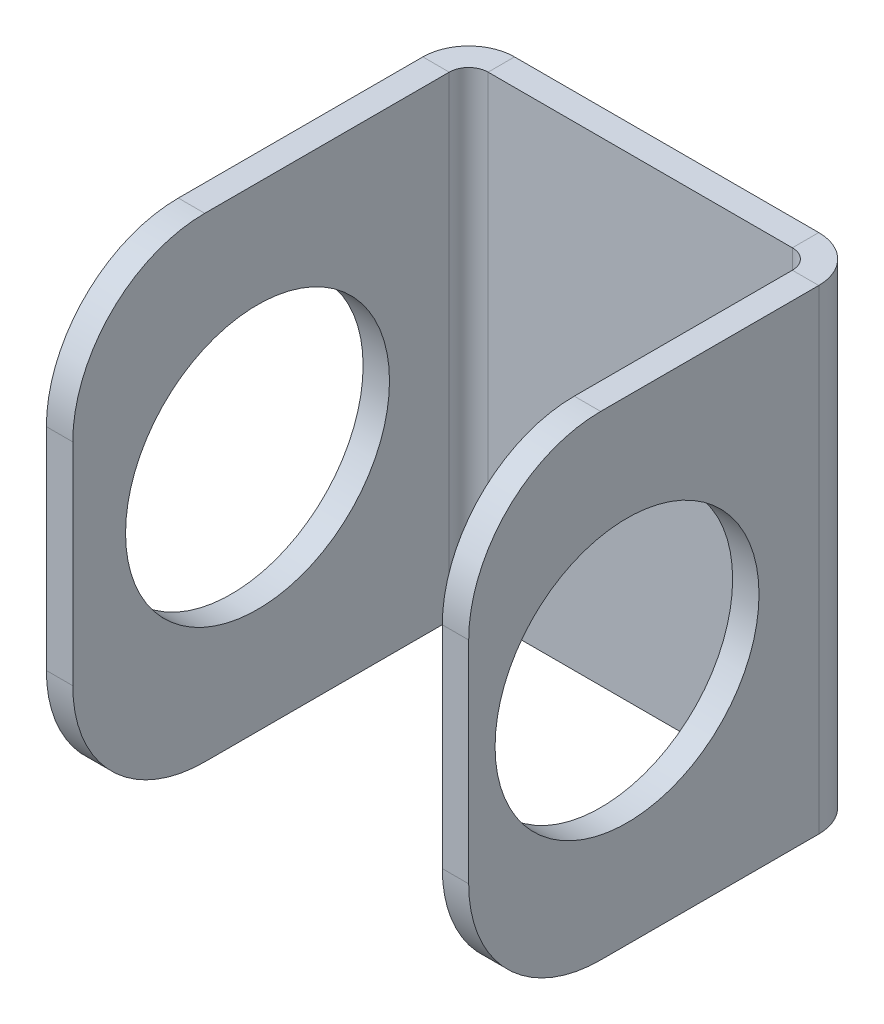
ISO-10303-21;
HEADER;
FILE_DESCRIPTION(('STEP AP214'),'2;1');
FILE_NAME('part.step','',(''),(''),'','','');
FILE_SCHEMA(('AUTOMOTIVE_DESIGN { 1 0 10303 214 1 1 1 1 }'));
ENDSEC;
DATA;
#1=APPLICATION_CONTEXT('core data for automotive mechanical design processes');
#2=APPLICATION_PROTOCOL_DEFINITION('international standard','automotive_design',2000,#1);
#3=PRODUCT_CONTEXT('',#1,'mechanical');
#4=PRODUCT('Part','Part','',(#3));
#5=PRODUCT_RELATED_PRODUCT_CATEGORY('part','',(#4));
#6=PRODUCT_DEFINITION_FORMATION('','',#4);
#7=PRODUCT_DEFINITION_CONTEXT('part definition',#1,'design');
#8=PRODUCT_DEFINITION('design','',#6,#7);
#9=PRODUCT_DEFINITION_SHAPE('','',#8);
#10=(LENGTH_UNIT() NAMED_UNIT(*) SI_UNIT(.MILLI.,.METRE.));
#11=(NAMED_UNIT(*) PLANE_ANGLE_UNIT() SI_UNIT($,.RADIAN.));
#12=(NAMED_UNIT(*) SI_UNIT($,.STERADIAN.) SOLID_ANGLE_UNIT());
#13=UNCERTAINTY_MEASURE_WITH_UNIT(LENGTH_MEASURE(1.E-05),#10,'distance_accuracy_value','');
#14=(GEOMETRIC_REPRESENTATION_CONTEXT(3) GLOBAL_UNCERTAINTY_ASSIGNED_CONTEXT((#13)) GLOBAL_UNIT_ASSIGNED_CONTEXT((#10,
#11,#12)) REPRESENTATION_CONTEXT('',''));
#15=CARTESIAN_POINT('',(0.,0.,0.));
#16=DIRECTION('',(0.,0.,1.));
#17=DIRECTION('',(1.,0.,0.));
#18=AXIS2_PLACEMENT_3D('',#15,#16,#17);
#19=CARTESIAN_POINT('',(0.,0.,-1.));
#20=DIRECTION('',(0.,0.,-1.));
#21=DIRECTION('',(-1.,0.,0.));
#22=AXIS2_PLACEMENT_3D('',#19,#20,#21);
#23=PLANE('',#22);
#24=DIRECTION('',(1.,0.,0.));
#25=VECTOR('',#24,1.);
#26=CARTESIAN_POINT('',(-7.5,-9.,-1.));
#27=LINE('',#26,#25);
#28=CARTESIAN_POINT('',(-5.7634,-9.,-0.999999999999999));
#29=VERTEX_POINT('',#28);
#30=CARTESIAN_POINT('',(5.7634,-9.,-1.));
#31=VERTEX_POINT('',#30);
#32=EDGE_CURVE('E309',#29,#31,#27,.T.);
#33=ORIENTED_EDGE('',*,*,#32,.F.);
#34=DIRECTION('',(0.,-1.,0.));
#35=VECTOR('',#34,1.);
#36=CARTESIAN_POINT('',(-5.7634,-9.,-0.999999999999999));
#37=LINE('',#36,#35);
#38=CARTESIAN_POINT('',(-5.7634,9.00000000000001,-1.));
#39=VERTEX_POINT('',#38);
#40=EDGE_CURVE('E203',#29,#39,#37,.F.);
#41=ORIENTED_EDGE('',*,*,#40,.T.);
#42=DIRECTION('',(-1.,0.,0.));
#43=VECTOR('',#42,1.);
#44=CARTESIAN_POINT('',(-7.5,9.,-1.));
#45=LINE('',#44,#43);
#46=CARTESIAN_POINT('',(5.7634,9.,-1.));
#47=VERTEX_POINT('',#46);
#48=EDGE_CURVE('E306',#47,#39,#45,.T.);
#49=ORIENTED_EDGE('',*,*,#48,.F.);
#50=DIRECTION('',(0.,1.,0.));
#51=VECTOR('',#50,1.);
#52=CARTESIAN_POINT('',(5.7634,9.,-1.));
#53=LINE('',#52,#51);
#54=EDGE_CURVE('E282',#47,#31,#53,.F.);
#55=ORIENTED_EDGE('',*,*,#54,.T.);
#56=EDGE_LOOP('',(#33,#41,#49,#55));
#57=FACE_BOUND('',#56,.T.);
#58=ADVANCED_FACE('F80',(#57),#23,.T.);
#59=CARTESIAN_POINT('',(0.,0.,0.));
#60=DIRECTION('',(0.,0.,-1.));
#61=DIRECTION('',(-1.,0.,0.));
#62=AXIS2_PLACEMENT_3D('',#59,#60,#61);
#63=PLANE('',#62);
#64=DIRECTION('',(0.,-1.,0.));
#65=VECTOR('',#64,1.);
#66=CARTESIAN_POINT('',(-5.7634,-9.,0.));
#67=LINE('',#66,#65);
#68=CARTESIAN_POINT('',(-5.7634,-9.,0.));
#69=VERTEX_POINT('',#68);
#70=CARTESIAN_POINT('',(-5.7634,9.,0.));
#71=VERTEX_POINT('',#70);
#72=EDGE_CURVE('E247',#69,#71,#67,.F.);
#73=ORIENTED_EDGE('',*,*,#72,.F.);
#74=DIRECTION('',(1.,0.,0.));
#75=VECTOR('',#74,1.);
#76=CARTESIAN_POINT('',(-7.5,-9.,0.));
#77=LINE('',#76,#75);
#78=CARTESIAN_POINT('',(5.7634,-9.,0.));
#79=VERTEX_POINT('',#78);
#80=EDGE_CURVE('E310',#69,#79,#77,.T.);
#81=ORIENTED_EDGE('',*,*,#80,.T.);
#82=DIRECTION('',(0.,1.,0.));
#83=VECTOR('',#82,1.);
#84=CARTESIAN_POINT('',(5.7634,9.,0.));
#85=LINE('',#84,#83);
#86=CARTESIAN_POINT('',(5.7634,9.,0.));
#87=VERTEX_POINT('',#86);
#88=EDGE_CURVE('E295',#87,#79,#85,.F.);
#89=ORIENTED_EDGE('',*,*,#88,.F.);
#90=DIRECTION('',(-1.,0.,0.));
#91=VECTOR('',#90,1.);
#92=CARTESIAN_POINT('',(-7.5,9.,0.));
#93=LINE('',#92,#91);
#94=EDGE_CURVE('E303',#87,#71,#93,.T.);
#95=ORIENTED_EDGE('',*,*,#94,.T.);
#96=EDGE_LOOP('',(#73,#81,#89,#95));
#97=FACE_BOUND('',#96,.T.);
#98=ADVANCED_FACE('F377',(#97),#63,.F.);
#99=CARTESIAN_POINT('',(-7.5,-9.,-1.));
#100=DIRECTION('',(0.,-1.,0.));
#101=DIRECTION('',(0.,0.,-1.));
#102=AXIS2_PLACEMENT_3D('',#99,#100,#101);
#103=PLANE('',#102);
#104=ORIENTED_EDGE('',*,*,#80,.F.);
#105=DIRECTION('',(0.,0.,-1.));
#106=VECTOR('',#105,1.);
#107=CARTESIAN_POINT('',(-5.7634,-9.,0.));
#108=LINE('',#107,#106);
#109=EDGE_CURVE('E243',#69,#29,#108,.T.);
#110=ORIENTED_EDGE('',*,*,#109,.T.);
#111=ORIENTED_EDGE('',*,*,#32,.T.);
#112=DIRECTION('',(0.,0.,-1.));
#113=VECTOR('',#112,1.);
#114=CARTESIAN_POINT('',(5.7634,-9.,0.));
#115=LINE('',#114,#113);
#116=EDGE_CURVE('E300',#79,#31,#115,.T.);
#117=ORIENTED_EDGE('',*,*,#116,.F.);
#118=EDGE_LOOP('',(#104,#110,#111,#117));
#119=FACE_BOUND('',#118,.T.);
#120=ADVANCED_FACE('F389',(#119),#103,.T.);
#121=CARTESIAN_POINT('',(-7.5,9.,-1.));
#122=DIRECTION('',(0.,1.,0.));
#123=DIRECTION('',(0.,0.,1.));
#124=AXIS2_PLACEMENT_3D('',#121,#122,#123);
#125=PLANE('',#124);
#126=DIRECTION('',(0.,0.,-1.));
#127=VECTOR('',#126,1.);
#128=CARTESIAN_POINT('',(-5.7634,9.,0.));
#129=LINE('',#128,#127);
#130=EDGE_CURVE('E250',#71,#39,#129,.T.);
#131=ORIENTED_EDGE('',*,*,#130,.F.);
#132=ORIENTED_EDGE('',*,*,#94,.F.);
#133=DIRECTION('',(0.,0.,-1.));
#134=VECTOR('',#133,1.);
#135=CARTESIAN_POINT('',(5.7634,9.,0.));
#136=LINE('',#135,#134);
#137=EDGE_CURVE('E289',#87,#47,#136,.T.);
#138=ORIENTED_EDGE('',*,*,#137,.T.);
#139=ORIENTED_EDGE('',*,*,#48,.T.);
#140=EDGE_LOOP('',(#131,#132,#138,#139));
#141=FACE_BOUND('',#140,.T.);
#142=ADVANCED_FACE('F373',(#141),#125,.T.);
#143=CARTESIAN_POINT('',(5.7634,-9.,0.7366));
#144=DIRECTION('',(0.,-1.,0.));
#145=DIRECTION('',(0.,0.,-1.));
#146=AXIS2_PLACEMENT_3D('',#143,#144,#145);
#147=PLANE('',#146);
#148=DIRECTION('',(-1.,0.,0.));
#149=VECTOR('',#148,1.);
#150=CARTESIAN_POINT('',(7.5,-9.,0.736599999999994));
#151=LINE('',#150,#149);
#152=CARTESIAN_POINT('',(6.5,-9.,0.736599999999997));
#153=VERTEX_POINT('',#152);
#154=CARTESIAN_POINT('',(7.5,-9.,0.736599999999994));
#155=VERTEX_POINT('',#154);
#156=EDGE_CURVE('E253',#153,#155,#151,.F.);
#157=ORIENTED_EDGE('',*,*,#156,.F.);
#158=CARTESIAN_POINT('',(5.7634,-9.,0.7366));
#159=DIRECTION('',(0.,1.,0.));
#160=DIRECTION('',(0.,0.,1.));
#161=AXIS2_PLACEMENT_3D('',#158,#159,#160);
#162=CIRCLE('',#161,0.7366);
#163=EDGE_CURVE('E292',#79,#153,#162,.F.);
#164=ORIENTED_EDGE('',*,*,#163,.F.);
#165=ORIENTED_EDGE('',*,*,#116,.T.);
#166=CARTESIAN_POINT('',(5.7634,-9.,0.7366));
#167=DIRECTION('',(0.,1.,0.));
#168=DIRECTION('',(0.,0.,1.));
#169=AXIS2_PLACEMENT_3D('',#166,#167,#168);
#170=CIRCLE('',#169,1.7366);
#171=EDGE_CURVE('E285',#31,#155,#170,.F.);
#172=ORIENTED_EDGE('',*,*,#171,.T.);
#173=EDGE_LOOP('',(#157,#164,#165,#172));
#174=FACE_BOUND('',#173,.T.);
#175=ADVANCED_FACE('F387',(#174),#147,.T.);
#176=CARTESIAN_POINT('',(5.7634,9.,0.736599999999999));
#177=DIRECTION('',(0.,-1.,0.));
#178=DIRECTION('',(0.,0.,-1.));
#179=AXIS2_PLACEMENT_3D('',#176,#177,#178);
#180=PLANE('',#179);
#181=CARTESIAN_POINT('',(5.7634,9.,0.736599999999999));
#182=DIRECTION('',(0.,1.,0.));
#183=DIRECTION('',(0.,0.,1.));
#184=AXIS2_PLACEMENT_3D('',#181,#182,#183);
#185=CIRCLE('',#184,0.7366);
#186=CARTESIAN_POINT('',(6.5,9.,0.736599999999996));
#187=VERTEX_POINT('',#186);
#188=EDGE_CURVE('E258',#187,#87,#185,.T.);
#189=ORIENTED_EDGE('',*,*,#188,.F.);
#190=DIRECTION('',(-1.,0.,0.));
#191=VECTOR('',#190,1.);
#192=CARTESIAN_POINT('',(6.5,8.99999999999999,0.736599999999996));
#193=LINE('',#192,#191);
#194=CARTESIAN_POINT('',(7.5,9.,0.736599999999993));
#195=VERTEX_POINT('',#194);
#196=EDGE_CURVE('E275',#187,#195,#193,.F.);
#197=ORIENTED_EDGE('',*,*,#196,.T.);
#198=CARTESIAN_POINT('',(5.7634,9.,0.736599999999999));
#199=DIRECTION('',(0.,1.,0.));
#200=DIRECTION('',(0.,0.,1.));
#201=AXIS2_PLACEMENT_3D('',#198,#199,#200);
#202=CIRCLE('',#201,1.7366);
#203=EDGE_CURVE('E286',#195,#47,#202,.T.);
#204=ORIENTED_EDGE('',*,*,#203,.T.);
#205=ORIENTED_EDGE('',*,*,#137,.F.);
#206=EDGE_LOOP('',(#189,#197,#204,#205));
#207=FACE_BOUND('',#206,.T.);
#208=ADVANCED_FACE('F407',(#207),#180,.F.);
#209=CARTESIAN_POINT('',(5.7634,9.,0.736599999999999));
#210=DIRECTION('',(0.,1.,0.));
#211=DIRECTION('',(1.,0.,0.));
#212=AXIS2_PLACEMENT_3D('',#209,#210,#211);
#213=CYLINDRICAL_SURFACE('',#212,1.7366);
#214=ORIENTED_EDGE('',*,*,#54,.F.);
#215=ORIENTED_EDGE('',*,*,#203,.F.);
#216=DIRECTION('',(0.,1.,0.));
#217=VECTOR('',#216,1.);
#218=CARTESIAN_POINT('',(7.5,-9.,0.736599999999994));
#219=LINE('',#218,#217);
#220=EDGE_CURVE('E272',#195,#155,#219,.F.);
#221=ORIENTED_EDGE('',*,*,#220,.T.);
#222=ORIENTED_EDGE('',*,*,#171,.F.);
#223=EDGE_LOOP('',(#214,#215,#221,#222));
#224=FACE_BOUND('',#223,.T.);
#225=ADVANCED_FACE('F394',(#224),#213,.T.);
#226=CARTESIAN_POINT('',(5.7634,9.,0.736599999999999));
#227=DIRECTION('',(0.,1.,0.));
#228=DIRECTION('',(1.,0.,0.));
#229=AXIS2_PLACEMENT_3D('',#226,#227,#228);
#230=CYLINDRICAL_SURFACE('',#229,0.7366);
#231=ORIENTED_EDGE('',*,*,#88,.T.);
#232=ORIENTED_EDGE('',*,*,#163,.T.);
#233=DIRECTION('',(0.,1.,0.));
#234=VECTOR('',#233,1.);
#235=CARTESIAN_POINT('',(6.5,-9.,0.736599999999998));
#236=LINE('',#235,#234);
#237=EDGE_CURVE('E278',#153,#187,#236,.T.);
#238=ORIENTED_EDGE('',*,*,#237,.T.);
#239=ORIENTED_EDGE('',*,*,#188,.T.);
#240=EDGE_LOOP('',(#231,#232,#238,#239));
#241=FACE_BOUND('',#240,.T.);
#242=ADVANCED_FACE('F381',(#241),#230,.F.);
#243=CARTESIAN_POINT('',(7.5,-9.,0.));
#244=DIRECTION('',(0.,1.,0.));
#245=DIRECTION('',(0.,0.,1.));
#246=AXIS2_PLACEMENT_3D('',#243,#244,#245);
#247=PLANE('',#246);
#248=DIRECTION('',(0.,0.,-1.));
#249=VECTOR('',#248,1.);
#250=CARTESIAN_POINT('',(7.5,-9.,0.));
#251=LINE('',#250,#249);
#252=CARTESIAN_POINT('',(7.50000000000003,-9.,9.));
#253=VERTEX_POINT('',#252);
#254=EDGE_CURVE('E262',#253,#155,#251,.T.);
#255=ORIENTED_EDGE('',*,*,#254,.F.);
#256=DIRECTION('',(-1.,0.,0.));
#257=VECTOR('',#256,1.);
#258=CARTESIAN_POINT('',(7.50000000000003,-9.,9.));
#259=LINE('',#258,#257);
#260=CARTESIAN_POINT('',(6.50000000000003,-9.,9.));
#261=VERTEX_POINT('',#260);
#262=EDGE_CURVE('E334',#253,#261,#259,.T.);
#263=ORIENTED_EDGE('',*,*,#262,.T.);
#264=DIRECTION('',(0.,0.,1.));
#265=VECTOR('',#264,1.);
#266=CARTESIAN_POINT('',(6.5,-9.,0.));
#267=LINE('',#266,#265);
#268=EDGE_CURVE('E270',#261,#153,#267,.F.);
#269=ORIENTED_EDGE('',*,*,#268,.T.);
#270=ORIENTED_EDGE('',*,*,#156,.T.);
#271=EDGE_LOOP('',(#255,#263,#269,#270));
#272=FACE_BOUND('',#271,.T.);
#273=ADVANCED_FACE('F398',(#272),#247,.F.);
#274=CARTESIAN_POINT('',(7.50000000000005,9.,14.));
#275=DIRECTION('',(0.,-1.,0.));
#276=DIRECTION('',(0.,0.,-1.));
#277=AXIS2_PLACEMENT_3D('',#274,#275,#276);
#278=PLANE('',#277);
#279=DIRECTION('',(0.,0.,-1.));
#280=VECTOR('',#279,1.);
#281=CARTESIAN_POINT('',(6.50000000000005,9.,14.));
#282=LINE('',#281,#280);
#283=CARTESIAN_POINT('',(6.50000000000003,9.,9.));
#284=VERTEX_POINT('',#283);
#285=EDGE_CURVE('E267',#187,#284,#282,.F.);
#286=ORIENTED_EDGE('',*,*,#285,.T.);
#287=DIRECTION('',(-1.,0.,0.));
#288=VECTOR('',#287,1.);
#289=CARTESIAN_POINT('',(7.50000000000003,9.,9.));
#290=LINE('',#289,#288);
#291=CARTESIAN_POINT('',(7.50000000000003,9.,9.));
#292=VERTEX_POINT('',#291);
#293=EDGE_CURVE('E328',#284,#292,#290,.F.);
#294=ORIENTED_EDGE('',*,*,#293,.T.);
#295=DIRECTION('',(0.,0.,1.));
#296=VECTOR('',#295,1.);
#297=CARTESIAN_POINT('',(7.5,9.,0.));
#298=LINE('',#297,#296);
#299=EDGE_CURVE('E259',#195,#292,#298,.T.);
#300=ORIENTED_EDGE('',*,*,#299,.F.);
#301=ORIENTED_EDGE('',*,*,#196,.F.);
#302=EDGE_LOOP('',(#286,#294,#300,#301));
#303=FACE_BOUND('',#302,.T.);
#304=ADVANCED_FACE('F410',(#303),#278,.F.);
#305=CARTESIAN_POINT('',(7.5,0.,0.));
#306=DIRECTION('',(-1.,0.,0.));
#307=DIRECTION('',(0.,0.,1.));
#308=AXIS2_PLACEMENT_3D('',#305,#306,#307);
#309=PLANE('',#308);
#310=CARTESIAN_POINT('',(7.50000000000007,0.,8.00000000000003));
#311=DIRECTION('',(-1.,0.,0.));
#312=DIRECTION('',(0.,0.,1.));
#313=AXIS2_PLACEMENT_3D('',#310,#311,#312);
#314=CIRCLE('',#313,5.);
#315=CARTESIAN_POINT('',(7.50000000000006,0.,13.));
#316=VERTEX_POINT('',#315);
#317=EDGE_CURVE('E319',#316,#316,#314,.T.);
#318=ORIENTED_EDGE('',*,*,#317,.T.);
#319=EDGE_LOOP('',(#318));
#320=FACE_BOUND('',#319,.T.);
#321=ORIENTED_EDGE('',*,*,#299,.T.);
#322=CARTESIAN_POINT('',(7.50000000000003,4.,9.));
#323=DIRECTION('',(-1.,0.,0.));
#324=DIRECTION('',(0.,0.,1.));
#325=AXIS2_PLACEMENT_3D('',#322,#323,#324);
#326=CIRCLE('',#325,5.);
#327=CARTESIAN_POINT('',(7.50000000000005,4.,14.));
#328=VERTEX_POINT('',#327);
#329=EDGE_CURVE('E332',#292,#328,#326,.F.);
#330=ORIENTED_EDGE('',*,*,#329,.T.);
#331=DIRECTION('',(0.,-1.,0.));
#332=VECTOR('',#331,1.);
#333=CARTESIAN_POINT('',(7.50000000000005,0.,14.));
#334=LINE('',#333,#332);
#335=CARTESIAN_POINT('',(7.50000000000005,-4.,14.));
#336=VERTEX_POINT('',#335);
#337=EDGE_CURVE('E255',#328,#336,#334,.T.);
#338=ORIENTED_EDGE('',*,*,#337,.T.);
#339=CARTESIAN_POINT('',(7.50000000000003,-4.,9.));
#340=DIRECTION('',(-1.,0.,0.));
#341=DIRECTION('',(0.,0.,1.));
#342=AXIS2_PLACEMENT_3D('',#339,#340,#341);
#343=CIRCLE('',#342,5.);
#344=EDGE_CURVE('E330',#336,#253,#343,.F.);
#345=ORIENTED_EDGE('',*,*,#344,.T.);
#346=ORIENTED_EDGE('',*,*,#254,.T.);
#347=ORIENTED_EDGE('',*,*,#220,.F.);
#348=EDGE_LOOP('',(#321,#330,#338,#345,#346,#347));
#349=FACE_BOUND('',#348,.T.);
#350=ADVANCED_FACE('F414',(#320,#349),#309,.F.);
#351=CARTESIAN_POINT('',(6.5,0.,0.));
#352=DIRECTION('',(-1.,0.,0.));
#353=DIRECTION('',(0.,0.,1.));
#354=AXIS2_PLACEMENT_3D('',#351,#352,#353);
#355=PLANE('',#354);
#356=CARTESIAN_POINT('',(6.50000000000003,0.,8.00000000000002));
#357=DIRECTION('',(-1.,0.,0.));
#358=DIRECTION('',(0.,0.,1.));
#359=AXIS2_PLACEMENT_3D('',#356,#357,#358);
#360=CIRCLE('',#359,5.);
#361=CARTESIAN_POINT('',(6.50000000000004,0.,13.));
#362=VERTEX_POINT('',#361);
#363=EDGE_CURVE('E240',#362,#362,#360,.T.);
#364=ORIENTED_EDGE('',*,*,#363,.F.);
#365=EDGE_LOOP('',(#364));
#366=FACE_BOUND('',#365,.T.);
#367=DIRECTION('',(0.,1.,0.));
#368=VECTOR('',#367,1.);
#369=CARTESIAN_POINT('',(6.50000000000005,-9.,14.));
#370=LINE('',#369,#368);
#371=CARTESIAN_POINT('',(6.50000000000005,4.,14.));
#372=VERTEX_POINT('',#371);
#373=CARTESIAN_POINT('',(6.50000000000005,-4.,14.));
#374=VERTEX_POINT('',#373);
#375=EDGE_CURVE('E264',#372,#374,#370,.F.);
#376=ORIENTED_EDGE('',*,*,#375,.F.);
#377=CARTESIAN_POINT('',(6.50000000000003,4.,9.));
#378=DIRECTION('',(-1.,0.,0.));
#379=DIRECTION('',(0.,0.,1.));
#380=AXIS2_PLACEMENT_3D('',#377,#378,#379);
#381=CIRCLE('',#380,5.);
#382=EDGE_CURVE('E326',#372,#284,#381,.T.);
#383=ORIENTED_EDGE('',*,*,#382,.T.);
#384=ORIENTED_EDGE('',*,*,#285,.F.);
#385=ORIENTED_EDGE('',*,*,#237,.F.);
#386=ORIENTED_EDGE('',*,*,#268,.F.);
#387=CARTESIAN_POINT('',(6.50000000000003,-4.,9.));
#388=DIRECTION('',(-1.,0.,0.));
#389=DIRECTION('',(0.,0.,1.));
#390=AXIS2_PLACEMENT_3D('',#387,#388,#389);
#391=CIRCLE('',#390,5.);
#392=EDGE_CURVE('E324',#261,#374,#391,.T.);
#393=ORIENTED_EDGE('',*,*,#392,.T.);
#394=EDGE_LOOP('',(#376,#383,#384,#385,#386,#393));
#395=FACE_BOUND('',#394,.T.);
#396=ADVANCED_FACE('F403',(#366,#395),#355,.T.);
#397=CARTESIAN_POINT('',(7.50000000000005,-9.,14.));
#398=DIRECTION('',(0.,0.,-1.));
#399=DIRECTION('',(-1.,0.,0.));
#400=AXIS2_PLACEMENT_3D('',#397,#398,#399);
#401=PLANE('',#400);
#402=ORIENTED_EDGE('',*,*,#337,.F.);
#403=DIRECTION('',(-1.,0.,0.));
#404=VECTOR('',#403,1.);
#405=CARTESIAN_POINT('',(7.50000000000005,4.,14.));
#406=LINE('',#405,#404);
#407=EDGE_CURVE('E321',#328,#372,#406,.T.);
#408=ORIENTED_EDGE('',*,*,#407,.T.);
#409=ORIENTED_EDGE('',*,*,#375,.T.);
#410=DIRECTION('',(-1.,0.,0.));
#411=VECTOR('',#410,1.);
#412=CARTESIAN_POINT('',(7.50000000000005,-4.,14.));
#413=LINE('',#412,#411);
#414=EDGE_CURVE('E312',#374,#336,#413,.F.);
#415=ORIENTED_EDGE('',*,*,#414,.T.);
#416=EDGE_LOOP('',(#402,#408,#409,#415));
#417=FACE_BOUND('',#416,.T.);
#418=ADVANCED_FACE('F420',(#417),#401,.F.);
#419=CARTESIAN_POINT('',(-5.7634,9.,0.7366));
#420=DIRECTION('',(0.,1.,0.));
#421=DIRECTION('',(0.,0.,1.));
#422=AXIS2_PLACEMENT_3D('',#419,#420,#421);
#423=PLANE('',#422);
#424=DIRECTION('',(1.,0.,0.));
#425=VECTOR('',#424,1.);
#426=CARTESIAN_POINT('',(-7.5,9.,0.736599999999994));
#427=LINE('',#426,#425);
#428=CARTESIAN_POINT('',(-6.5,9.,0.736599999999998));
#429=VERTEX_POINT('',#428);
#430=CARTESIAN_POINT('',(-7.5,9.,0.736599999999994));
#431=VERTEX_POINT('',#430);
#432=EDGE_CURVE('E237',#429,#431,#427,.F.);
#433=ORIENTED_EDGE('',*,*,#432,.F.);
#434=CARTESIAN_POINT('',(-5.7634,9.,0.7366));
#435=DIRECTION('',(0.,-1.,0.));
#436=DIRECTION('',(0.,0.,-1.));
#437=AXIS2_PLACEMENT_3D('',#434,#435,#436);
#438=CIRCLE('',#437,0.7366);
#439=EDGE_CURVE('E206',#71,#429,#438,.F.);
#440=ORIENTED_EDGE('',*,*,#439,.F.);
#441=ORIENTED_EDGE('',*,*,#130,.T.);
#442=CARTESIAN_POINT('',(-5.7634,9.,0.7366));
#443=DIRECTION('',(0.,-1.,0.));
#444=DIRECTION('',(0.,0.,-1.));
#445=AXIS2_PLACEMENT_3D('',#442,#443,#444);
#446=CIRCLE('',#445,1.7366);
#447=EDGE_CURVE('E242',#39,#431,#446,.F.);
#448=ORIENTED_EDGE('',*,*,#447,.T.);
#449=EDGE_LOOP('',(#433,#440,#441,#448));
#450=FACE_BOUND('',#449,.T.);
#451=ADVANCED_FACE('F370',(#450),#423,.T.);
#452=CARTESIAN_POINT('',(-5.7634,-9.,0.7366));
#453=DIRECTION('',(0.,1.,0.));
#454=DIRECTION('',(0.,0.,1.));
#455=AXIS2_PLACEMENT_3D('',#452,#453,#454);
#456=PLANE('',#455);
#457=CARTESIAN_POINT('',(-5.7634,-9.,0.7366));
#458=DIRECTION('',(0.,-1.,0.));
#459=DIRECTION('',(0.,0.,-1.));
#460=AXIS2_PLACEMENT_3D('',#457,#458,#459);
#461=CIRCLE('',#460,0.7366);
#462=CARTESIAN_POINT('',(-6.5,-9.,0.736599999999998));
#463=VERTEX_POINT('',#462);
#464=EDGE_CURVE('E213',#463,#69,#461,.T.);
#465=ORIENTED_EDGE('',*,*,#464,.F.);
#466=DIRECTION('',(1.,0.,0.));
#467=VECTOR('',#466,1.);
#468=CARTESIAN_POINT('',(-6.5,-9.,0.736599999999998));
#469=LINE('',#468,#467);
#470=CARTESIAN_POINT('',(-7.5,-9.,0.736599999999994));
#471=VERTEX_POINT('',#470);
#472=EDGE_CURVE('E210',#463,#471,#469,.F.);
#473=ORIENTED_EDGE('',*,*,#472,.T.);
#474=CARTESIAN_POINT('',(-5.7634,-9.,0.7366));
#475=DIRECTION('',(0.,-1.,0.));
#476=DIRECTION('',(0.,0.,-1.));
#477=AXIS2_PLACEMENT_3D('',#474,#475,#476);
#478=CIRCLE('',#477,1.7366);
#479=EDGE_CURVE('E196',#471,#29,#478,.T.);
#480=ORIENTED_EDGE('',*,*,#479,.T.);
#481=ORIENTED_EDGE('',*,*,#109,.F.);
#482=EDGE_LOOP('',(#465,#473,#480,#481));
#483=FACE_BOUND('',#482,.T.);
#484=ADVANCED_FACE('F211',(#483),#456,.F.);
#485=CARTESIAN_POINT('',(-5.7634,-9.,0.7366));
#486=DIRECTION('',(0.,-1.,0.));
#487=DIRECTION('',(-1.,0.,0.));
#488=AXIS2_PLACEMENT_3D('',#485,#486,#487);
#489=CYLINDRICAL_SURFACE('',#488,1.7366);
#490=ORIENTED_EDGE('',*,*,#40,.F.);
#491=ORIENTED_EDGE('',*,*,#479,.F.);
#492=DIRECTION('',(0.,-1.,0.));
#493=VECTOR('',#492,1.);
#494=CARTESIAN_POINT('',(-7.5,9.,0.736599999999994));
#495=LINE('',#494,#493);
#496=EDGE_CURVE('E200',#471,#431,#495,.F.);
#497=ORIENTED_EDGE('',*,*,#496,.T.);
#498=ORIENTED_EDGE('',*,*,#447,.F.);
#499=EDGE_LOOP('',(#490,#491,#497,#498));
#500=FACE_BOUND('',#499,.T.);
#501=ADVANCED_FACE('F198',(#500),#489,.T.);
#502=CARTESIAN_POINT('',(-5.7634,-9.,0.7366));
#503=DIRECTION('',(0.,-1.,0.));
#504=DIRECTION('',(-1.,0.,0.));
#505=AXIS2_PLACEMENT_3D('',#502,#503,#504);
#506=CYLINDRICAL_SURFACE('',#505,0.7366);
#507=ORIENTED_EDGE('',*,*,#72,.T.);
#508=ORIENTED_EDGE('',*,*,#439,.T.);
#509=DIRECTION('',(0.,-1.,0.));
#510=VECTOR('',#509,1.);
#511=CARTESIAN_POINT('',(-6.5,9.,0.736599999999998));
#512=LINE('',#511,#510);
#513=EDGE_CURVE('E215',#429,#463,#512,.T.);
#514=ORIENTED_EDGE('',*,*,#513,.T.);
#515=ORIENTED_EDGE('',*,*,#464,.T.);
#516=EDGE_LOOP('',(#507,#508,#514,#515));
#517=FACE_BOUND('',#516,.T.);
#518=ADVANCED_FACE('F365',(#517),#506,.F.);
#519=CARTESIAN_POINT('',(-7.5,9.,0.));
#520=DIRECTION('',(0.,-1.,0.));
#521=DIRECTION('',(0.,0.,-1.));
#522=AXIS2_PLACEMENT_3D('',#519,#520,#521);
#523=PLANE('',#522);
#524=DIRECTION('',(0.,0.,-1.));
#525=VECTOR('',#524,1.);
#526=CARTESIAN_POINT('',(-7.5,9.,0.));
#527=LINE('',#526,#525);
#528=CARTESIAN_POINT('',(-7.50000000000004,9.,9.99999999999999));
#529=VERTEX_POINT('',#528);
#530=EDGE_CURVE('E220',#529,#431,#527,.T.);
#531=ORIENTED_EDGE('',*,*,#530,.F.);
#532=DIRECTION('',(1.,0.,0.));
#533=VECTOR('',#532,1.);
#534=CARTESIAN_POINT('',(-7.50000000000004,9.,9.99999999999999));
#535=LINE('',#534,#533);
#536=CARTESIAN_POINT('',(-6.50000000000004,9.,10.));
#537=VERTEX_POINT('',#536);
#538=EDGE_CURVE('E13',#529,#537,#535,.T.);
#539=ORIENTED_EDGE('',*,*,#538,.T.);
#540=DIRECTION('',(0.,0.,1.));
#541=VECTOR('',#540,1.);
#542=CARTESIAN_POINT('',(-6.5,9.,0.));
#543=LINE('',#542,#541);
#544=EDGE_CURVE('E221',#537,#429,#543,.F.);
#545=ORIENTED_EDGE('',*,*,#544,.T.);
#546=ORIENTED_EDGE('',*,*,#432,.T.);
#547=EDGE_LOOP('',(#531,#539,#545,#546));
#548=FACE_BOUND('',#547,.T.);
#549=ADVANCED_FACE('F362',(#548),#523,.F.);
#550=CARTESIAN_POINT('',(-7.50000000000005,-9.,15.));
#551=DIRECTION('',(0.,1.,0.));
#552=DIRECTION('',(0.,0.,1.));
#553=AXIS2_PLACEMENT_3D('',#550,#551,#552);
#554=PLANE('',#553);
#555=DIRECTION('',(0.,0.,-1.));
#556=VECTOR('',#555,1.);
#557=CARTESIAN_POINT('',(-6.50000000000005,-9.,15.));
#558=LINE('',#557,#556);
#559=CARTESIAN_POINT('',(-6.50000000000004,-9.,10.));
#560=VERTEX_POINT('',#559);
#561=EDGE_CURVE('E233',#463,#560,#558,.F.);
#562=ORIENTED_EDGE('',*,*,#561,.T.);
#563=DIRECTION('',(1.,0.,0.));
#564=VECTOR('',#563,1.);
#565=CARTESIAN_POINT('',(-7.50000000000004,-9.,9.99999999999999));
#566=LINE('',#565,#564);
#567=CARTESIAN_POINT('',(-7.50000000000004,-9.,9.99999999999999));
#568=VERTEX_POINT('',#567);
#569=EDGE_CURVE('E103',#560,#568,#566,.F.);
#570=ORIENTED_EDGE('',*,*,#569,.T.);
#571=DIRECTION('',(0.,0.,1.));
#572=VECTOR('',#571,1.);
#573=CARTESIAN_POINT('',(-7.5,-9.,0.));
#574=LINE('',#573,#572);
#575=EDGE_CURVE('E218',#471,#568,#574,.T.);
#576=ORIENTED_EDGE('',*,*,#575,.F.);
#577=ORIENTED_EDGE('',*,*,#472,.F.);
#578=EDGE_LOOP('',(#562,#570,#576,#577));
#579=FACE_BOUND('',#578,.T.);
#580=ADVANCED_FACE('F223',(#579),#554,.F.);
#581=CARTESIAN_POINT('',(-7.5,0.,0.));
#582=DIRECTION('',(1.,0.,0.));
#583=DIRECTION('',(0.,0.,-1.));
#584=AXIS2_PLACEMENT_3D('',#581,#582,#583);
#585=PLANE('',#584);
#586=CARTESIAN_POINT('',(-7.50000000000003,0.,7.99999999999997));
#587=DIRECTION('',(-1.,0.,0.));
#588=DIRECTION('',(0.,0.,1.));
#589=AXIS2_PLACEMENT_3D('',#586,#587,#588);
#590=CIRCLE('',#589,5.);
#591=CARTESIAN_POINT('',(-7.50000000000004,0.,13.));
#592=VERTEX_POINT('',#591);
#593=EDGE_CURVE('E500',#592,#592,#590,.T.);
#594=ORIENTED_EDGE('',*,*,#593,.F.);
#595=EDGE_LOOP('',(#594));
#596=FACE_BOUND('',#595,.T.);
#597=ORIENTED_EDGE('',*,*,#575,.T.);
#598=CARTESIAN_POINT('',(-7.50000000000004,-4.,9.99999999999999));
#599=DIRECTION('',(1.,0.,0.));
#600=DIRECTION('',(0.,0.,-1.));
#601=AXIS2_PLACEMENT_3D('',#598,#599,#600);
#602=CIRCLE('',#601,5.);
#603=CARTESIAN_POINT('',(-7.50000000000005,-4.,15.));
#604=VERTEX_POINT('',#603);
#605=EDGE_CURVE('E88',#568,#604,#602,.F.);
#606=ORIENTED_EDGE('',*,*,#605,.T.);
#607=DIRECTION('',(0.,1.,0.));
#608=VECTOR('',#607,1.);
#609=CARTESIAN_POINT('',(-7.50000000000005,0.,15.));
#610=LINE('',#609,#608);
#611=CARTESIAN_POINT('',(-7.50000000000005,4.,15.));
#612=VERTEX_POINT('',#611);
#613=EDGE_CURVE('E224',#604,#612,#610,.T.);
#614=ORIENTED_EDGE('',*,*,#613,.T.);
#615=CARTESIAN_POINT('',(-7.50000000000004,4.,9.99999999999999));
#616=DIRECTION('',(1.,0.,0.));
#617=DIRECTION('',(0.,0.,-1.));
#618=AXIS2_PLACEMENT_3D('',#615,#616,#617);
#619=CIRCLE('',#618,5.);
#620=EDGE_CURVE('E95',#612,#529,#619,.F.);
#621=ORIENTED_EDGE('',*,*,#620,.T.);
#622=ORIENTED_EDGE('',*,*,#530,.T.);
#623=ORIENTED_EDGE('',*,*,#496,.F.);
#624=EDGE_LOOP('',(#597,#606,#614,#621,#622,#623));
#625=FACE_BOUND('',#624,.T.);
#626=ADVANCED_FACE('F217',(#596,#625),#585,.F.);
#627=CARTESIAN_POINT('',(-6.5,0.,0.));
#628=DIRECTION('',(1.,0.,0.));
#629=DIRECTION('',(0.,0.,-1.));
#630=AXIS2_PLACEMENT_3D('',#627,#628,#629);
#631=PLANE('',#630);
#632=CARTESIAN_POINT('',(-6.50000000000003,0.,7.99999999999998));
#633=DIRECTION('',(1.,0.,0.));
#634=DIRECTION('',(0.,0.,-1.));
#635=AXIS2_PLACEMENT_3D('',#632,#633,#634);
#636=CIRCLE('',#635,5.);
#637=CARTESIAN_POINT('',(-6.50000000000004,0.,13.));
#638=VERTEX_POINT('',#637);
#639=EDGE_CURVE('E316',#638,#638,#636,.T.);
#640=ORIENTED_EDGE('',*,*,#639,.F.);
#641=EDGE_LOOP('',(#640));
#642=FACE_BOUND('',#641,.T.);
#643=DIRECTION('',(0.,-1.,0.));
#644=VECTOR('',#643,1.);
#645=CARTESIAN_POINT('',(-6.50000000000005,9.,15.));
#646=LINE('',#645,#644);
#647=CARTESIAN_POINT('',(-6.50000000000005,-4.,15.));
#648=VERTEX_POINT('',#647);
#649=CARTESIAN_POINT('',(-6.50000000000005,4.,15.));
#650=VERTEX_POINT('',#649);
#651=EDGE_CURVE('E227',#648,#650,#646,.F.);
#652=ORIENTED_EDGE('',*,*,#651,.F.);
#653=CARTESIAN_POINT('',(-6.50000000000004,-4.,10.));
#654=DIRECTION('',(1.,0.,0.));
#655=DIRECTION('',(0.,0.,-1.));
#656=AXIS2_PLACEMENT_3D('',#653,#654,#655);
#657=CIRCLE('',#656,5.);
#658=EDGE_CURVE('E344',#648,#560,#657,.T.);
#659=ORIENTED_EDGE('',*,*,#658,.T.);
#660=ORIENTED_EDGE('',*,*,#561,.F.);
#661=ORIENTED_EDGE('',*,*,#513,.F.);
#662=ORIENTED_EDGE('',*,*,#544,.F.);
#663=CARTESIAN_POINT('',(-6.50000000000004,4.,10.));
#664=DIRECTION('',(1.,0.,0.));
#665=DIRECTION('',(0.,0.,-1.));
#666=AXIS2_PLACEMENT_3D('',#663,#664,#665);
#667=CIRCLE('',#666,5.);
#668=EDGE_CURVE('E342',#537,#650,#667,.T.);
#669=ORIENTED_EDGE('',*,*,#668,.T.);
#670=EDGE_LOOP('',(#652,#659,#660,#661,#662,#669));
#671=FACE_BOUND('',#670,.T.);
#672=ADVANCED_FACE('F356',(#642,#671),#631,.T.);
#673=CARTESIAN_POINT('',(-7.50000000000005,9.,15.));
#674=DIRECTION('',(0.,0.,-1.));
#675=DIRECTION('',(-1.,0.,0.));
#676=AXIS2_PLACEMENT_3D('',#673,#674,#675);
#677=PLANE('',#676);
#678=ORIENTED_EDGE('',*,*,#613,.F.);
#679=DIRECTION('',(1.,0.,0.));
#680=VECTOR('',#679,1.);
#681=CARTESIAN_POINT('',(-7.50000000000005,-4.,15.));
#682=LINE('',#681,#680);
#683=EDGE_CURVE('E339',#604,#648,#682,.T.);
#684=ORIENTED_EDGE('',*,*,#683,.T.);
#685=ORIENTED_EDGE('',*,*,#651,.T.);
#686=DIRECTION('',(1.,0.,0.));
#687=VECTOR('',#686,1.);
#688=CARTESIAN_POINT('',(-7.50000000000005,4.,15.));
#689=LINE('',#688,#687);
#690=EDGE_CURVE('E337',#650,#612,#689,.F.);
#691=ORIENTED_EDGE('',*,*,#690,.T.);
#692=EDGE_LOOP('',(#678,#684,#685,#691));
#693=FACE_BOUND('',#692,.T.);
#694=ADVANCED_FACE('F351',(#693),#677,.F.);
#695=CARTESIAN_POINT('',(7.50000000000007,0.,8.00000000000003));
#696=DIRECTION('',(-1.,0.,0.));
#697=DIRECTION('',(0.,0.,1.));
#698=AXIS2_PLACEMENT_3D('',#695,#696,#697);
#699=CYLINDRICAL_SURFACE('',#698,5.);
#700=CARTESIAN_POINT('',(-6.50000000000004,0.,13.));
#701=CARTESIAN_POINT('',(-6.51041666666671,0.,13.));
#702=CARTESIAN_POINT('',(-6.52083333333338,0.,13.));
#703=CARTESIAN_POINT('',(-6.54166666666671,0.,13.));
#704=CARTESIAN_POINT('',(-6.55208333333338,0.,13.));
#705=CARTESIAN_POINT('',(-6.57291666666671,0.,13.));
#706=CARTESIAN_POINT('',(-6.58333333333338,0.,13.));
#707=CARTESIAN_POINT('',(-6.60416666666671,0.,13.));
#708=CARTESIAN_POINT('',(-6.61458333333338,0.,13.));
#709=CARTESIAN_POINT('',(-6.63541666666671,0.,13.));
#710=CARTESIAN_POINT('',(-6.64583333333338,0.,13.));
#711=CARTESIAN_POINT('',(-6.66666666666671,0.,13.));
#712=CARTESIAN_POINT('',(-6.67708333333338,0.,13.));
#713=CARTESIAN_POINT('',(-6.69791666666671,0.,13.));
#714=CARTESIAN_POINT('',(-6.70833333333338,0.,13.));
#715=CARTESIAN_POINT('',(-6.72916666666671,0.,13.));
#716=CARTESIAN_POINT('',(-6.73958333333338,0.,13.));
#717=CARTESIAN_POINT('',(-6.76041666666671,0.,13.));
#718=CARTESIAN_POINT('',(-6.77083333333338,0.,13.));
#719=CARTESIAN_POINT('',(-6.79166666666671,0.,13.));
#720=CARTESIAN_POINT('',(-6.80208333333338,0.,13.));
#721=CARTESIAN_POINT('',(-6.82291666666671,0.,13.));
#722=CARTESIAN_POINT('',(-6.83333333333338,0.,13.));
#723=CARTESIAN_POINT('',(-6.85416666666671,0.,13.));
#724=CARTESIAN_POINT('',(-6.86458333333338,0.,13.));
#725=CARTESIAN_POINT('',(-6.88541666666671,0.,13.));
#726=CARTESIAN_POINT('',(-6.89583333333338,0.,13.));
#727=CARTESIAN_POINT('',(-6.91666666666671,0.,13.));
#728=CARTESIAN_POINT('',(-6.92708333333338,0.,13.));
#729=CARTESIAN_POINT('',(-6.94791666666671,0.,13.));
#730=CARTESIAN_POINT('',(-6.95833333333338,0.,13.));
#731=CARTESIAN_POINT('',(-6.97916666666671,0.,13.));
#732=CARTESIAN_POINT('',(-6.98958333333338,0.,13.));
#733=CARTESIAN_POINT('',(-7.01041666666671,0.,13.));
#734=CARTESIAN_POINT('',(-7.02083333333338,0.,13.));
#735=CARTESIAN_POINT('',(-7.04166666666671,0.,13.));
#736=CARTESIAN_POINT('',(-7.05208333333338,0.,13.));
#737=CARTESIAN_POINT('',(-7.07291666666671,0.,13.));
#738=CARTESIAN_POINT('',(-7.08333333333338,0.,13.));
#739=CARTESIAN_POINT('',(-7.10416666666671,0.,13.));
#740=CARTESIAN_POINT('',(-7.11458333333338,0.,13.));
#741=CARTESIAN_POINT('',(-7.13541666666671,0.,13.));
#742=CARTESIAN_POINT('',(-7.14583333333338,0.,13.));
#743=CARTESIAN_POINT('',(-7.16666666666671,0.,13.));
#744=CARTESIAN_POINT('',(-7.17708333333338,0.,13.));
#745=CARTESIAN_POINT('',(-7.19791666666671,0.,13.));
#746=CARTESIAN_POINT('',(-7.20833333333338,0.,13.));
#747=CARTESIAN_POINT('',(-7.22916666666671,0.,13.));
#748=CARTESIAN_POINT('',(-7.23958333333338,0.,13.));
#749=CARTESIAN_POINT('',(-7.26041666666671,0.,13.));
#750=CARTESIAN_POINT('',(-7.27083333333338,0.,13.));
#751=CARTESIAN_POINT('',(-7.29166666666671,0.,13.));
#752=CARTESIAN_POINT('',(-7.30208333333338,0.,13.));
#753=CARTESIAN_POINT('',(-7.32291666666671,0.,13.));
#754=CARTESIAN_POINT('',(-7.33333333333338,0.,13.));
#755=CARTESIAN_POINT('',(-7.35416666666671,0.,13.));
#756=CARTESIAN_POINT('',(-7.36458333333338,0.,13.));
#757=CARTESIAN_POINT('',(-7.38541666666671,0.,13.));
#758=CARTESIAN_POINT('',(-7.39583333333338,0.,13.));
#759=CARTESIAN_POINT('',(-7.41666666666671,0.,13.));
#760=CARTESIAN_POINT('',(-7.42708333333338,0.,13.));
#761=CARTESIAN_POINT('',(-7.44791666666671,0.,13.));
#762=CARTESIAN_POINT('',(-7.45833333333338,0.,13.));
#763=CARTESIAN_POINT('',(-7.47916666666671,0.,13.));
#764=CARTESIAN_POINT('',(-7.48958333333338,0.,13.));
#765=CARTESIAN_POINT('',(-7.50000000000004,0.,13.));
#766=B_SPLINE_CURVE_WITH_KNOTS('',3,(#700,#701,#702,#703,#704,#705,#706,#707,#708,#709,#710,
#711,#712,#713,#714,#715,#716,#717,#718,#719,#720,#721,#722,#723,#724,#725,#726,#727,#728,#729,
#730,#731,#732,#733,#734,#735,#736,#737,#738,#739,#740,#741,#742,#743,#744,#745,#746,#747,#748,
#749,#750,#751,#752,#753,#754,#755,#756,#757,#758,#759,#760,#761,#762,#763,#764,#765),
.UNSPECIFIED.,.F.,.F.,(4,2,2,2,2,2,2,2,2,2,2,2,2,2,2,2,2,2,2,2,2,2,2,2,2,2,2,2,2,2,2,2,4),(0.,
0.03125,0.0625000000000001,0.0937500000000001,0.125,0.15625,0.1875,0.21875,0.25,0.28125,0.3125,
0.34375,0.375,0.40625,0.4375,0.46875,0.5,0.53125,0.5625,0.593750000000001,0.625000000000001,
0.656250000000001,0.687500000000001,0.718750000000001,0.750000000000001,0.781250000000001,
0.812500000000001,0.843750000000001,0.875000000000001,0.906250000000001,0.937500000000001,
0.968750000000001,1.),.UNSPECIFIED.);
#767=EDGE_CURVE('BSEAM482',#638,#592,#766,.T.);
#768=ORIENTED_EDGE('',*,*,#639,.T.);
#769=ORIENTED_EDGE('',*,*,#593,.T.);
#770=ORIENTED_EDGE('',*,*,#767,.T.);
#771=ORIENTED_EDGE('',*,*,#767,.F.);
#772=EDGE_LOOP('',(#768,#770,#769,#771));
#773=FACE_BOUND('',#772,.T.);
#774=ADVANCED_FACE('F482',(#773),#699,.F.);
#775=CARTESIAN_POINT('',(6.50000000000004,0.,13.));
#776=CARTESIAN_POINT('',(6.51041666666671,0.,13.));
#777=CARTESIAN_POINT('',(6.52083333333338,0.,13.));
#778=CARTESIAN_POINT('',(6.54166666666671,0.,13.));
#779=CARTESIAN_POINT('',(6.55208333333338,0.,13.));
#780=CARTESIAN_POINT('',(6.57291666666671,0.,13.));
#781=CARTESIAN_POINT('',(6.58333333333338,0.,13.));
#782=CARTESIAN_POINT('',(6.60416666666671,0.,13.));
#783=CARTESIAN_POINT('',(6.61458333333338,0.,13.));
#784=CARTESIAN_POINT('',(6.63541666666671,0.,13.));
#785=CARTESIAN_POINT('',(6.64583333333338,0.,13.));
#786=CARTESIAN_POINT('',(6.66666666666671,0.,13.));
#787=CARTESIAN_POINT('',(6.67708333333338,0.,13.));
#788=CARTESIAN_POINT('',(6.69791666666671,0.,13.));
#789=CARTESIAN_POINT('',(6.70833333333338,0.,13.));
#790=CARTESIAN_POINT('',(6.72916666666671,0.,13.));
#791=CARTESIAN_POINT('',(6.73958333333338,0.,13.));
#792=CARTESIAN_POINT('',(6.76041666666671,0.,13.));
#793=CARTESIAN_POINT('',(6.77083333333338,0.,13.));
#794=CARTESIAN_POINT('',(6.79166666666671,0.,13.));
#795=CARTESIAN_POINT('',(6.80208333333338,0.,13.));
#796=CARTESIAN_POINT('',(6.82291666666671,0.,13.));
#797=CARTESIAN_POINT('',(6.83333333333338,0.,13.));
#798=CARTESIAN_POINT('',(6.85416666666671,0.,13.));
#799=CARTESIAN_POINT('',(6.86458333333338,0.,13.));
#800=CARTESIAN_POINT('',(6.88541666666671,0.,13.));
#801=CARTESIAN_POINT('',(6.89583333333338,0.,13.));
#802=CARTESIAN_POINT('',(6.91666666666671,0.,13.));
#803=CARTESIAN_POINT('',(6.92708333333338,0.,13.));
#804=CARTESIAN_POINT('',(6.94791666666671,0.,13.));
#805=CARTESIAN_POINT('',(6.95833333333338,0.,13.));
#806=CARTESIAN_POINT('',(6.97916666666671,0.,13.));
#807=CARTESIAN_POINT('',(6.98958333333338,0.,13.));
#808=CARTESIAN_POINT('',(7.01041666666672,0.,13.));
#809=CARTESIAN_POINT('',(7.02083333333338,0.,13.));
#810=CARTESIAN_POINT('',(7.04166666666672,0.,13.));
#811=CARTESIAN_POINT('',(7.05208333333338,0.,13.));
#812=CARTESIAN_POINT('',(7.07291666666672,0.,13.));
#813=CARTESIAN_POINT('',(7.08333333333338,0.,13.));
#814=CARTESIAN_POINT('',(7.10416666666672,0.,13.));
#815=CARTESIAN_POINT('',(7.11458333333338,0.,13.));
#816=CARTESIAN_POINT('',(7.13541666666672,0.,13.));
#817=CARTESIAN_POINT('',(7.14583333333338,0.,13.));
#818=CARTESIAN_POINT('',(7.16666666666672,0.,13.));
#819=CARTESIAN_POINT('',(7.17708333333338,0.,13.));
#820=CARTESIAN_POINT('',(7.19791666666672,0.,13.));
#821=CARTESIAN_POINT('',(7.20833333333339,0.,13.));
#822=CARTESIAN_POINT('',(7.22916666666672,0.,13.));
#823=CARTESIAN_POINT('',(7.23958333333339,0.,13.));
#824=CARTESIAN_POINT('',(7.26041666666672,0.,13.));
#825=CARTESIAN_POINT('',(7.27083333333339,0.,13.));
#826=CARTESIAN_POINT('',(7.29166666666672,0.,13.));
#827=CARTESIAN_POINT('',(7.30208333333339,0.,13.));
#828=CARTESIAN_POINT('',(7.32291666666672,0.,13.));
#829=CARTESIAN_POINT('',(7.33333333333339,0.,13.));
#830=CARTESIAN_POINT('',(7.35416666666672,0.,13.));
#831=CARTESIAN_POINT('',(7.36458333333339,0.,13.));
#832=CARTESIAN_POINT('',(7.38541666666672,0.,13.));
#833=CARTESIAN_POINT('',(7.39583333333339,0.,13.));
#834=CARTESIAN_POINT('',(7.41666666666672,0.,13.));
#835=CARTESIAN_POINT('',(7.42708333333339,0.,13.));
#836=CARTESIAN_POINT('',(7.44791666666672,0.,13.));
#837=CARTESIAN_POINT('',(7.45833333333339,0.,13.));
#838=CARTESIAN_POINT('',(7.47916666666672,0.,13.));
#839=CARTESIAN_POINT('',(7.48958333333339,0.,13.));
#840=CARTESIAN_POINT('',(7.50000000000005,0.,13.));
#841=B_SPLINE_CURVE_WITH_KNOTS('',3,(#775,#776,#777,#778,#779,#780,#781,#782,#783,#784,#785,
#786,#787,#788,#789,#790,#791,#792,#793,#794,#795,#796,#797,#798,#799,#800,#801,#802,#803,#804,
#805,#806,#807,#808,#809,#810,#811,#812,#813,#814,#815,#816,#817,#818,#819,#820,#821,#822,#823,
#824,#825,#826,#827,#828,#829,#830,#831,#832,#833,#834,#835,#836,#837,#838,#839,#840),
.UNSPECIFIED.,.F.,.F.,(4,2,2,2,2,2,2,2,2,2,2,2,2,2,2,2,2,2,2,2,2,2,2,2,2,2,2,2,2,2,2,2,4),(0.,
0.0312500000000009,0.0625000000000009,0.0937500000000009,0.125000000000002,0.156250000000002,
0.187500000000003,0.218750000000003,0.250000000000003,0.281250000000004,0.312500000000004,
0.343750000000004,0.375000000000005,0.406250000000005,0.437500000000006,0.468750000000006,
0.500000000000006,0.531250000000007,0.562500000000007,0.593750000000007,0.625000000000008,
0.656250000000008,0.687500000000008,0.718750000000008,0.750000000000008,0.781250000000009,
0.812500000000009,0.84375000000001,0.87500000000001,0.90625000000001,0.937500000000011,
0.968750000000011,1.00000000000001),.UNSPECIFIED.);
#842=EDGE_CURVE('BSEAM431',#362,#316,#841,.T.);
#843=ORIENTED_EDGE('',*,*,#363,.T.);
#844=ORIENTED_EDGE('',*,*,#317,.F.);
#845=ORIENTED_EDGE('',*,*,#842,.T.);
#846=ORIENTED_EDGE('',*,*,#842,.F.);
#847=EDGE_LOOP('',(#843,#845,#844,#846));
#848=FACE_BOUND('',#847,.T.);
#849=ADVANCED_FACE('F431',(#848),#699,.F.);
#850=CARTESIAN_POINT('',(7.50000000000003,4.,9.));
#851=DIRECTION('',(-1.,0.,0.));
#852=DIRECTION('',(0.,0.,1.));
#853=AXIS2_PLACEMENT_3D('',#850,#851,#852);
#854=CYLINDRICAL_SURFACE('',#853,5.);
#855=ORIENTED_EDGE('',*,*,#329,.F.);
#856=ORIENTED_EDGE('',*,*,#293,.F.);
#857=ORIENTED_EDGE('',*,*,#382,.F.);
#858=ORIENTED_EDGE('',*,*,#407,.F.);
#859=EDGE_LOOP('',(#855,#856,#857,#858));
#860=FACE_BOUND('',#859,.T.);
#861=ADVANCED_FACE('F418',(#860),#854,.T.);
#862=CARTESIAN_POINT('',(7.50000000000003,-4.,9.));
#863=DIRECTION('',(-1.,0.,0.));
#864=DIRECTION('',(0.,0.,1.));
#865=AXIS2_PLACEMENT_3D('',#862,#863,#864);
#866=CYLINDRICAL_SURFACE('',#865,5.);
#867=ORIENTED_EDGE('',*,*,#344,.F.);
#868=ORIENTED_EDGE('',*,*,#414,.F.);
#869=ORIENTED_EDGE('',*,*,#392,.F.);
#870=ORIENTED_EDGE('',*,*,#262,.F.);
#871=EDGE_LOOP('',(#867,#868,#869,#870));
#872=FACE_BOUND('',#871,.T.);
#873=ADVANCED_FACE('F424',(#872),#866,.T.);
#874=CARTESIAN_POINT('',(-7.50000000000004,-4.,9.99999999999999));
#875=DIRECTION('',(1.,0.,0.));
#876=DIRECTION('',(0.,0.,-1.));
#877=AXIS2_PLACEMENT_3D('',#874,#875,#876);
#878=CYLINDRICAL_SURFACE('',#877,5.);
#879=ORIENTED_EDGE('',*,*,#605,.F.);
#880=ORIENTED_EDGE('',*,*,#569,.F.);
#881=ORIENTED_EDGE('',*,*,#658,.F.);
#882=ORIENTED_EDGE('',*,*,#683,.F.);
#883=EDGE_LOOP('',(#879,#880,#881,#882));
#884=FACE_BOUND('',#883,.T.);
#885=ADVANCED_FACE('F354',(#884),#878,.T.);
#886=CARTESIAN_POINT('',(-7.50000000000004,4.,9.99999999999999));
#887=DIRECTION('',(1.,0.,0.));
#888=DIRECTION('',(0.,0.,-1.));
#889=AXIS2_PLACEMENT_3D('',#886,#887,#888);
#890=CYLINDRICAL_SURFACE('',#889,5.);
#891=ORIENTED_EDGE('',*,*,#620,.F.);
#892=ORIENTED_EDGE('',*,*,#690,.F.);
#893=ORIENTED_EDGE('',*,*,#668,.F.);
#894=ORIENTED_EDGE('',*,*,#538,.F.);
#895=EDGE_LOOP('',(#891,#892,#893,#894));
#896=FACE_BOUND('',#895,.T.);
#897=ADVANCED_FACE('F82',(#896),#890,.T.);
#898=CLOSED_SHELL('',(#58,#98,#120,#142,#175,#208,#225,#242,#273,#304,#350,#396,#418,#451,#484,
#501,#518,#549,#580,#626,#672,#694,#774,#849,#861,#873,#885,#897));
#899=MANIFOLD_SOLID_BREP('B2',#898);
#900=ADVANCED_BREP_SHAPE_REPRESENTATION('',(#18,#899),#14);
#901=SHAPE_DEFINITION_REPRESENTATION(#9,#900);
ENDSEC;
END-ISO-10303-21;
